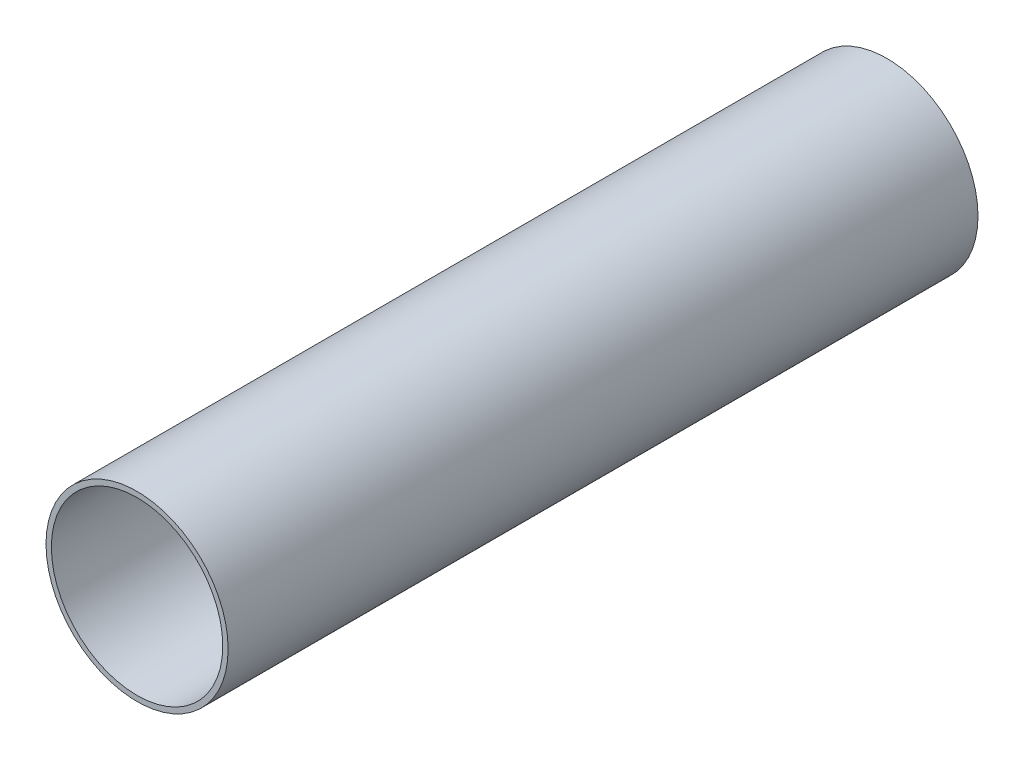
ISO-10303-21;
HEADER;
FILE_DESCRIPTION(('STEP AP214'),'2;1');
FILE_NAME('part.step','',(''),(''),'','','');
FILE_SCHEMA(('AUTOMOTIVE_DESIGN { 1 0 10303 214 1 1 1 1 }'));
ENDSEC;
DATA;
#1=APPLICATION_CONTEXT('core data for automotive mechanical design processes');
#2=APPLICATION_PROTOCOL_DEFINITION('international standard','automotive_design',2000,#1);
#3=PRODUCT_CONTEXT('',#1,'mechanical');
#4=PRODUCT('Part','Part','',(#3));
#5=PRODUCT_RELATED_PRODUCT_CATEGORY('part','',(#4));
#6=PRODUCT_DEFINITION_FORMATION('','',#4);
#7=PRODUCT_DEFINITION_CONTEXT('part definition',#1,'design');
#8=PRODUCT_DEFINITION('design','',#6,#7);
#9=PRODUCT_DEFINITION_SHAPE('','',#8);
#10=(LENGTH_UNIT() NAMED_UNIT(*) SI_UNIT(.MILLI.,.METRE.));
#11=(NAMED_UNIT(*) PLANE_ANGLE_UNIT() SI_UNIT($,.RADIAN.));
#12=(NAMED_UNIT(*) SI_UNIT($,.STERADIAN.) SOLID_ANGLE_UNIT());
#13=UNCERTAINTY_MEASURE_WITH_UNIT(LENGTH_MEASURE(1.E-05),#10,'distance_accuracy_value','');
#14=(GEOMETRIC_REPRESENTATION_CONTEXT(3) GLOBAL_UNCERTAINTY_ASSIGNED_CONTEXT((#13)) GLOBAL_UNIT_ASSIGNED_CONTEXT((#10,
#11,#12)) REPRESENTATION_CONTEXT('',''));
#15=CARTESIAN_POINT('',(0.,0.,0.));
#16=DIRECTION('',(0.,0.,1.));
#17=DIRECTION('',(1.,0.,0.));
#18=AXIS2_PLACEMENT_3D('',#15,#16,#17);
#19=CARTESIAN_POINT('',(0.,0.,210.));
#20=DIRECTION('',(0.,0.,1.));
#21=DIRECTION('',(1.,0.,0.));
#22=AXIS2_PLACEMENT_3D('',#19,#20,#21);
#23=PLANE('',#22);
#24=CARTESIAN_POINT('',(0.,0.,210.));
#25=DIRECTION('',(0.,0.,1.));
#26=DIRECTION('',(1.,0.,0.));
#27=AXIS2_PLACEMENT_3D('',#24,#25,#26);
#28=CIRCLE('',#27,25.5);
#29=CARTESIAN_POINT('',(25.5,0.,210.));
#30=VERTEX_POINT('',#29);
#31=EDGE_CURVE('E10',#30,#30,#28,.T.);
#32=ORIENTED_EDGE('',*,*,#31,.T.);
#33=EDGE_LOOP('',(#32));
#34=FACE_BOUND('',#33,.T.);
#35=CARTESIAN_POINT('',(0.,0.,210.));
#36=DIRECTION('',(0.,0.,1.));
#37=DIRECTION('',(1.,0.,0.));
#38=AXIS2_PLACEMENT_3D('',#35,#36,#37);
#39=CIRCLE('',#38,24.);
#40=CARTESIAN_POINT('',(24.,0.,210.));
#41=VERTEX_POINT('',#40);
#42=EDGE_CURVE('E54',#41,#41,#39,.T.);
#43=ORIENTED_EDGE('',*,*,#42,.F.);
#44=EDGE_LOOP('',(#43));
#45=FACE_BOUND('',#44,.T.);
#46=ADVANCED_FACE('F41',(#34,#45),#23,.T.);
#47=CARTESIAN_POINT('',(0.,0.,0.));
#48=DIRECTION('',(0.,0.,1.));
#49=DIRECTION('',(1.,0.,0.));
#50=AXIS2_PLACEMENT_3D('',#47,#48,#49);
#51=PLANE('',#50);
#52=CARTESIAN_POINT('',(0.,0.,0.));
#53=DIRECTION('',(0.,0.,1.));
#54=DIRECTION('',(1.,0.,0.));
#55=AXIS2_PLACEMENT_3D('',#52,#53,#54);
#56=CIRCLE('',#55,25.5);
#57=CARTESIAN_POINT('',(25.5,0.,0.));
#58=VERTEX_POINT('',#57);
#59=EDGE_CURVE('E45',#58,#58,#56,.T.);
#60=ORIENTED_EDGE('',*,*,#59,.F.);
#61=EDGE_LOOP('',(#60));
#62=FACE_BOUND('',#61,.T.);
#63=CARTESIAN_POINT('',(0.,0.,0.));
#64=DIRECTION('',(0.,0.,1.));
#65=DIRECTION('',(1.,0.,0.));
#66=AXIS2_PLACEMENT_3D('',#63,#64,#65);
#67=CIRCLE('',#66,24.);
#68=CARTESIAN_POINT('',(24.,0.,0.));
#69=VERTEX_POINT('',#68);
#70=EDGE_CURVE('E56',#69,#69,#67,.T.);
#71=ORIENTED_EDGE('',*,*,#70,.T.);
#72=EDGE_LOOP('',(#71));
#73=FACE_BOUND('',#72,.T.);
#74=ADVANCED_FACE('F68',(#62,#73),#51,.F.);
#75=CARTESIAN_POINT('',(0.,0.,210.));
#76=DIRECTION('',(0.,0.,-1.));
#77=DIRECTION('',(-1.,0.,0.));
#78=AXIS2_PLACEMENT_3D('',#75,#76,#77);
#79=CYLINDRICAL_SURFACE('',#78,25.5);
#80=ORIENTED_EDGE('',*,*,#31,.F.);
#81=EDGE_LOOP('',(#80));
#82=FACE_BOUND('',#81,.T.);
#83=ORIENTED_EDGE('',*,*,#59,.T.);
#84=EDGE_LOOP('',(#83));
#85=FACE_BOUND('',#84,.T.);
#86=ADVANCED_FACE('F43',(#82,#85),#79,.T.);
#87=CARTESIAN_POINT('',(0.,0.,210.));
#88=DIRECTION('',(0.,0.,-1.));
#89=DIRECTION('',(-1.,0.,0.));
#90=AXIS2_PLACEMENT_3D('',#87,#88,#89);
#91=CYLINDRICAL_SURFACE('',#90,24.);
#92=ORIENTED_EDGE('',*,*,#42,.T.);
#93=EDGE_LOOP('',(#92));
#94=FACE_BOUND('',#93,.T.);
#95=ORIENTED_EDGE('',*,*,#70,.F.);
#96=EDGE_LOOP('',(#95));
#97=FACE_BOUND('',#96,.T.);
#98=ADVANCED_FACE('F64',(#94,#97),#91,.F.);
#99=CLOSED_SHELL('',(#46,#74,#86,#98));
#100=MANIFOLD_SOLID_BREP('B2',#99);
#101=ADVANCED_BREP_SHAPE_REPRESENTATION('',(#18,#100),#14);
#102=SHAPE_DEFINITION_REPRESENTATION(#9,#101);
ENDSEC;
END-ISO-10303-21;
